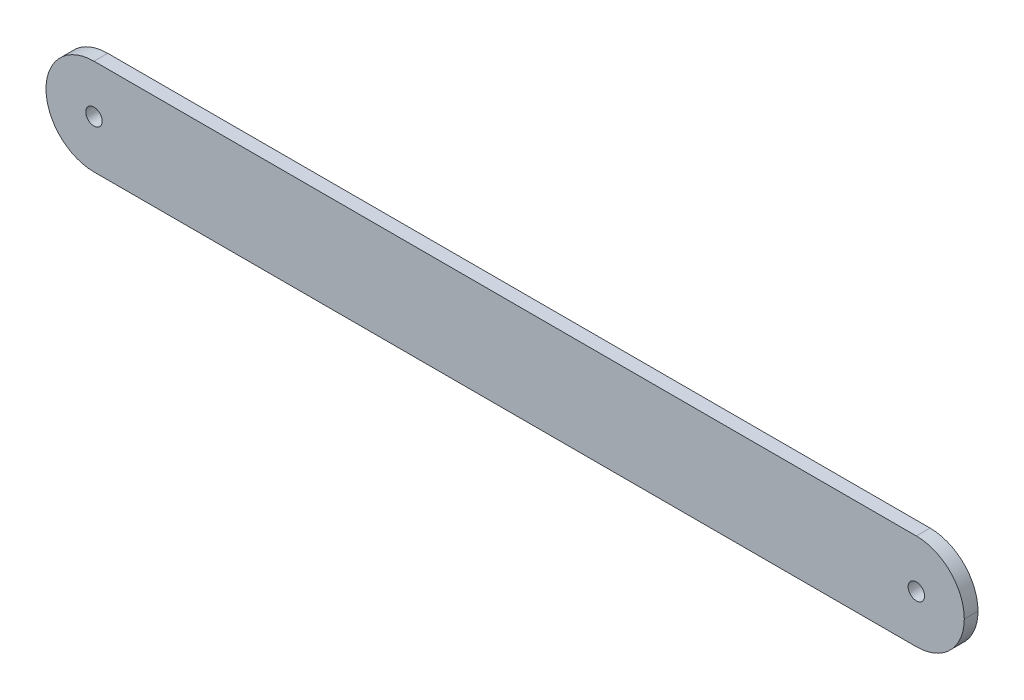
ISO-10303-21;
HEADER;
FILE_DESCRIPTION(('STEP AP214'),'2;1');
FILE_NAME('part.step','',(''),(''),'','','');
FILE_SCHEMA(('AUTOMOTIVE_DESIGN { 1 0 10303 214 1 1 1 1 }'));
ENDSEC;
DATA;
#1=APPLICATION_CONTEXT('core data for automotive mechanical design processes');
#2=APPLICATION_PROTOCOL_DEFINITION('international standard','automotive_design',2000,#1);
#3=PRODUCT_CONTEXT('',#1,'mechanical');
#4=PRODUCT('Part','Part','',(#3));
#5=PRODUCT_RELATED_PRODUCT_CATEGORY('part','',(#4));
#6=PRODUCT_DEFINITION_FORMATION('','',#4);
#7=PRODUCT_DEFINITION_CONTEXT('part definition',#1,'design');
#8=PRODUCT_DEFINITION('design','',#6,#7);
#9=PRODUCT_DEFINITION_SHAPE('','',#8);
#10=(LENGTH_UNIT() NAMED_UNIT(*) SI_UNIT(.MILLI.,.METRE.));
#11=(NAMED_UNIT(*) PLANE_ANGLE_UNIT() SI_UNIT($,.RADIAN.));
#12=(NAMED_UNIT(*) SI_UNIT($,.STERADIAN.) SOLID_ANGLE_UNIT());
#13=UNCERTAINTY_MEASURE_WITH_UNIT(LENGTH_MEASURE(1.E-05),#10,'distance_accuracy_value','');
#14=(GEOMETRIC_REPRESENTATION_CONTEXT(3) GLOBAL_UNCERTAINTY_ASSIGNED_CONTEXT((#13)) GLOBAL_UNIT_ASSIGNED_CONTEXT((#10,
#11,#12)) REPRESENTATION_CONTEXT('',''));
#15=CARTESIAN_POINT('',(0.,0.,0.));
#16=DIRECTION('',(0.,0.,1.));
#17=DIRECTION('',(1.,0.,0.));
#18=AXIS2_PLACEMENT_3D('',#15,#16,#17);
#19=CARTESIAN_POINT('',(-335.,35.,10.));
#20=DIRECTION('',(0.,-1.,0.));
#21=DIRECTION('',(0.,0.,-1.));
#22=AXIS2_PLACEMENT_3D('',#19,#20,#21);
#23=PLANE('',#22);
#24=DIRECTION('',(-1.,0.,0.));
#25=VECTOR('',#24,1.);
#26=CARTESIAN_POINT('',(-335.,35.,10.));
#27=LINE('',#26,#25);
#28=CARTESIAN_POINT('',(300.,35.,10.));
#29=VERTEX_POINT('',#28);
#30=CARTESIAN_POINT('',(-300.,35.,10.));
#31=VERTEX_POINT('',#30);
#32=EDGE_CURVE('E132',#29,#31,#27,.T.);
#33=ORIENTED_EDGE('',*,*,#32,.F.);
#34=DIRECTION('',(0.,0.,-1.));
#35=VECTOR('',#34,1.);
#36=CARTESIAN_POINT('',(300.,35.,10.));
#37=LINE('',#36,#35);
#38=CARTESIAN_POINT('',(300.,35.,0.));
#39=VERTEX_POINT('',#38);
#40=EDGE_CURVE('E11',#29,#39,#37,.T.);
#41=ORIENTED_EDGE('',*,*,#40,.T.);
#42=DIRECTION('',(-1.,0.,0.));
#43=VECTOR('',#42,1.);
#44=CARTESIAN_POINT('',(-335.,35.,0.));
#45=LINE('',#44,#43);
#46=CARTESIAN_POINT('',(-300.,35.,0.));
#47=VERTEX_POINT('',#46);
#48=EDGE_CURVE('E95',#39,#47,#45,.T.);
#49=ORIENTED_EDGE('',*,*,#48,.T.);
#50=DIRECTION('',(0.,0.,-1.));
#51=VECTOR('',#50,1.);
#52=CARTESIAN_POINT('',(-300.,35.,10.));
#53=LINE('',#52,#51);
#54=EDGE_CURVE('E42',#47,#31,#53,.F.);
#55=ORIENTED_EDGE('',*,*,#54,.T.);
#56=EDGE_LOOP('',(#33,#41,#49,#55));
#57=FACE_BOUND('',#56,.T.);
#58=ADVANCED_FACE('F33',(#57),#23,.F.);
#59=CARTESIAN_POINT('',(-335.,-35.,10.));
#60=DIRECTION('',(0.,1.,0.));
#61=DIRECTION('',(0.,0.,1.));
#62=AXIS2_PLACEMENT_3D('',#59,#60,#61);
#63=PLANE('',#62);
#64=DIRECTION('',(1.,0.,0.));
#65=VECTOR('',#64,1.);
#66=CARTESIAN_POINT('',(-335.,-35.,0.));
#67=LINE('',#66,#65);
#68=CARTESIAN_POINT('',(-300.,-35.,0.));
#69=VERTEX_POINT('',#68);
#70=CARTESIAN_POINT('',(300.,-35.,0.));
#71=VERTEX_POINT('',#70);
#72=EDGE_CURVE('E131',#69,#71,#67,.T.);
#73=ORIENTED_EDGE('',*,*,#72,.T.);
#74=DIRECTION('',(0.,0.,-1.));
#75=VECTOR('',#74,1.);
#76=CARTESIAN_POINT('',(300.,-35.,10.));
#77=LINE('',#76,#75);
#78=CARTESIAN_POINT('',(300.,-35.,10.));
#79=VERTEX_POINT('',#78);
#80=EDGE_CURVE('E110',#71,#79,#77,.F.);
#81=ORIENTED_EDGE('',*,*,#80,.T.);
#82=DIRECTION('',(1.,0.,0.));
#83=VECTOR('',#82,1.);
#84=CARTESIAN_POINT('',(-335.,-35.,10.));
#85=LINE('',#84,#83);
#86=CARTESIAN_POINT('',(-300.,-35.,10.));
#87=VERTEX_POINT('',#86);
#88=EDGE_CURVE('E127',#87,#79,#85,.T.);
#89=ORIENTED_EDGE('',*,*,#88,.F.);
#90=DIRECTION('',(0.,0.,-1.));
#91=VECTOR('',#90,1.);
#92=CARTESIAN_POINT('',(-300.,-35.,10.));
#93=LINE('',#92,#91);
#94=EDGE_CURVE('E111',#87,#69,#93,.T.);
#95=ORIENTED_EDGE('',*,*,#94,.T.);
#96=EDGE_LOOP('',(#73,#81,#89,#95));
#97=FACE_BOUND('',#96,.T.);
#98=ADVANCED_FACE('F129',(#97),#63,.F.);
#99=CARTESIAN_POINT('',(0.,0.,10.));
#100=DIRECTION('',(0.,0.,-1.));
#101=DIRECTION('',(-1.,0.,0.));
#102=AXIS2_PLACEMENT_3D('',#99,#100,#101);
#103=PLANE('',#102);
#104=CARTESIAN_POINT('',(-300.,0.,10.));
#105=DIRECTION('',(0.,0.,1.));
#106=DIRECTION('',(1.,0.,0.));
#107=AXIS2_PLACEMENT_3D('',#104,#105,#106);
#108=CIRCLE('',#107,5.99999999999999);
#109=CARTESIAN_POINT('',(-294.,0.,10.));
#110=VERTEX_POINT('',#109);
#111=EDGE_CURVE('E187',#110,#110,#108,.T.);
#112=ORIENTED_EDGE('',*,*,#111,.F.);
#113=EDGE_LOOP('',(#112));
#114=FACE_BOUND('',#113,.T.);
#115=CARTESIAN_POINT('',(300.,0.,10.));
#116=DIRECTION('',(0.,0.,1.));
#117=DIRECTION('',(1.,0.,0.));
#118=AXIS2_PLACEMENT_3D('',#115,#116,#117);
#119=CIRCLE('',#118,5.99999999999999);
#120=CARTESIAN_POINT('',(306.,0.,10.));
#121=VERTEX_POINT('',#120);
#122=EDGE_CURVE('E106',#121,#121,#119,.T.);
#123=ORIENTED_EDGE('',*,*,#122,.F.);
#124=EDGE_LOOP('',(#123));
#125=FACE_BOUND('',#124,.T.);
#126=ORIENTED_EDGE('',*,*,#88,.T.);
#127=CARTESIAN_POINT('',(300.,0.,10.));
#128=DIRECTION('',(0.,0.,-1.));
#129=DIRECTION('',(-1.,0.,0.));
#130=AXIS2_PLACEMENT_3D('',#127,#128,#129);
#131=CIRCLE('',#130,35.);
#132=CARTESIAN_POINT('',(335.,0.,10.));
#133=VERTEX_POINT('',#132);
#134=EDGE_CURVE('E122',#79,#133,#131,.F.);
#135=ORIENTED_EDGE('',*,*,#134,.T.);
#136=CARTESIAN_POINT('',(300.,0.,10.));
#137=DIRECTION('',(0.,0.,-1.));
#138=DIRECTION('',(-1.,0.,0.));
#139=AXIS2_PLACEMENT_3D('',#136,#137,#138);
#140=CIRCLE('',#139,35.);
#141=EDGE_CURVE('E104',#133,#29,#140,.F.);
#142=ORIENTED_EDGE('',*,*,#141,.T.);
#143=ORIENTED_EDGE('',*,*,#32,.T.);
#144=CARTESIAN_POINT('',(-300.,0.,10.));
#145=DIRECTION('',(0.,0.,-1.));
#146=DIRECTION('',(-1.,0.,0.));
#147=AXIS2_PLACEMENT_3D('',#144,#145,#146);
#148=CIRCLE('',#147,35.);
#149=CARTESIAN_POINT('',(-335.,0.,10.));
#150=VERTEX_POINT('',#149);
#151=EDGE_CURVE('E50',#31,#150,#148,.F.);
#152=ORIENTED_EDGE('',*,*,#151,.T.);
#153=CARTESIAN_POINT('',(-300.,0.,10.));
#154=DIRECTION('',(0.,0.,-1.));
#155=DIRECTION('',(-1.,0.,0.));
#156=AXIS2_PLACEMENT_3D('',#153,#154,#155);
#157=CIRCLE('',#156,35.);
#158=EDGE_CURVE('E119',#150,#87,#157,.F.);
#159=ORIENTED_EDGE('',*,*,#158,.T.);
#160=EDGE_LOOP('',(#126,#135,#142,#143,#152,#159));
#161=FACE_BOUND('',#160,.T.);
#162=ADVANCED_FACE('F125',(#114,#125,#161),#103,.F.);
#163=CARTESIAN_POINT('',(0.,0.,0.));
#164=DIRECTION('',(0.,0.,-1.));
#165=DIRECTION('',(-1.,0.,0.));
#166=AXIS2_PLACEMENT_3D('',#163,#164,#165);
#167=PLANE('',#166);
#168=CARTESIAN_POINT('',(-300.,0.,0.));
#169=DIRECTION('',(0.,0.,1.));
#170=DIRECTION('',(1.,0.,0.));
#171=AXIS2_PLACEMENT_3D('',#168,#169,#170);
#172=CIRCLE('',#171,5.99999999999999);
#173=CARTESIAN_POINT('',(-294.,0.,0.));
#174=VERTEX_POINT('',#173);
#175=EDGE_CURVE('E135',#174,#174,#172,.T.);
#176=ORIENTED_EDGE('',*,*,#175,.T.);
#177=EDGE_LOOP('',(#176));
#178=FACE_BOUND('',#177,.T.);
#179=CARTESIAN_POINT('',(300.,0.,0.));
#180=DIRECTION('',(0.,0.,1.));
#181=DIRECTION('',(1.,0.,0.));
#182=AXIS2_PLACEMENT_3D('',#179,#180,#181);
#183=CIRCLE('',#182,5.99999999999999);
#184=CARTESIAN_POINT('',(306.,0.,0.));
#185=VERTEX_POINT('',#184);
#186=EDGE_CURVE('E186',#185,#185,#183,.T.);
#187=ORIENTED_EDGE('',*,*,#186,.T.);
#188=EDGE_LOOP('',(#187));
#189=FACE_BOUND('',#188,.T.);
#190=CARTESIAN_POINT('',(300.,0.,0.));
#191=DIRECTION('',(0.,0.,-1.));
#192=DIRECTION('',(-1.,0.,0.));
#193=AXIS2_PLACEMENT_3D('',#190,#191,#192);
#194=CIRCLE('',#193,35.);
#195=CARTESIAN_POINT('',(335.,0.,0.));
#196=VERTEX_POINT('',#195);
#197=EDGE_CURVE('E88',#39,#196,#194,.T.);
#198=ORIENTED_EDGE('',*,*,#197,.T.);
#199=CARTESIAN_POINT('',(300.,0.,0.));
#200=DIRECTION('',(0.,0.,-1.));
#201=DIRECTION('',(-1.,0.,0.));
#202=AXIS2_PLACEMENT_3D('',#199,#200,#201);
#203=CIRCLE('',#202,35.);
#204=EDGE_CURVE('E93',#196,#71,#203,.T.);
#205=ORIENTED_EDGE('',*,*,#204,.T.);
#206=ORIENTED_EDGE('',*,*,#72,.F.);
#207=CARTESIAN_POINT('',(-300.,0.,0.));
#208=DIRECTION('',(0.,0.,-1.));
#209=DIRECTION('',(-1.,0.,0.));
#210=AXIS2_PLACEMENT_3D('',#207,#208,#209);
#211=CIRCLE('',#210,35.);
#212=CARTESIAN_POINT('',(-335.,0.,0.));
#213=VERTEX_POINT('',#212);
#214=EDGE_CURVE('E98',#69,#213,#211,.T.);
#215=ORIENTED_EDGE('',*,*,#214,.T.);
#216=CARTESIAN_POINT('',(-300.,0.,0.));
#217=DIRECTION('',(0.,0.,-1.));
#218=DIRECTION('',(-1.,0.,0.));
#219=AXIS2_PLACEMENT_3D('',#216,#217,#218);
#220=CIRCLE('',#219,35.);
#221=EDGE_CURVE('E139',#213,#47,#220,.T.);
#222=ORIENTED_EDGE('',*,*,#221,.T.);
#223=ORIENTED_EDGE('',*,*,#48,.F.);
#224=EDGE_LOOP('',(#198,#205,#206,#215,#222,#223));
#225=FACE_BOUND('',#224,.T.);
#226=ADVANCED_FACE('F90',(#178,#189,#225),#167,.T.);
#227=CARTESIAN_POINT('',(300.,0.,0.));
#228=DIRECTION('',(0.,0.,1.));
#229=DIRECTION('',(1.,0.,0.));
#230=AXIS2_PLACEMENT_3D('',#227,#228,#229);
#231=CYLINDRICAL_SURFACE('',#230,5.99999999999999);
#232=ORIENTED_EDGE('',*,*,#186,.F.);
#233=EDGE_LOOP('',(#232));
#234=FACE_BOUND('',#233,.T.);
#235=ORIENTED_EDGE('',*,*,#122,.T.);
#236=EDGE_LOOP('',(#235));
#237=FACE_BOUND('',#236,.T.);
#238=ADVANCED_FACE('F165',(#234,#237),#231,.F.);
#239=CARTESIAN_POINT('',(-300.,0.,0.));
#240=DIRECTION('',(0.,0.,1.));
#241=DIRECTION('',(1.,0.,0.));
#242=AXIS2_PLACEMENT_3D('',#239,#240,#241);
#243=CYLINDRICAL_SURFACE('',#242,5.99999999999999);
#244=ORIENTED_EDGE('',*,*,#175,.F.);
#245=EDGE_LOOP('',(#244));
#246=FACE_BOUND('',#245,.T.);
#247=ORIENTED_EDGE('',*,*,#111,.T.);
#248=EDGE_LOOP('',(#247));
#249=FACE_BOUND('',#248,.T.);
#250=ADVANCED_FACE('F161',(#246,#249),#243,.F.);
#251=CARTESIAN_POINT('',(300.,0.,10.));
#252=DIRECTION('',(0.,0.,-1.));
#253=DIRECTION('',(-1.,0.,0.));
#254=AXIS2_PLACEMENT_3D('',#251,#252,#253);
#255=CYLINDRICAL_SURFACE('',#254,35.);
#256=ORIENTED_EDGE('',*,*,#40,.F.);
#257=ORIENTED_EDGE('',*,*,#141,.F.);
#258=DIRECTION('',(0.,0.,-1.));
#259=VECTOR('',#258,1.);
#260=CARTESIAN_POINT('',(335.,0.,10.));
#261=LINE('',#260,#259);
#262=EDGE_CURVE('E102',#196,#133,#261,.F.);
#263=ORIENTED_EDGE('',*,*,#262,.F.);
#264=ORIENTED_EDGE('',*,*,#197,.F.);
#265=EDGE_LOOP('',(#256,#257,#263,#264));
#266=FACE_BOUND('',#265,.T.);
#267=ADVANCED_FACE('F103',(#266),#255,.T.);
#268=CARTESIAN_POINT('',(300.,0.,10.));
#269=DIRECTION('',(0.,0.,-1.));
#270=DIRECTION('',(-1.,0.,0.));
#271=AXIS2_PLACEMENT_3D('',#268,#269,#270);
#272=CYLINDRICAL_SURFACE('',#271,35.);
#273=ORIENTED_EDGE('',*,*,#134,.F.);
#274=ORIENTED_EDGE('',*,*,#80,.F.);
#275=ORIENTED_EDGE('',*,*,#204,.F.);
#276=ORIENTED_EDGE('',*,*,#262,.T.);
#277=EDGE_LOOP('',(#273,#274,#275,#276));
#278=FACE_BOUND('',#277,.T.);
#279=ADVANCED_FACE('F108',(#278),#272,.T.);
#280=CARTESIAN_POINT('',(-300.,0.,10.));
#281=DIRECTION('',(0.,0.,-1.));
#282=DIRECTION('',(-1.,0.,0.));
#283=AXIS2_PLACEMENT_3D('',#280,#281,#282);
#284=CYLINDRICAL_SURFACE('',#283,35.);
#285=DIRECTION('',(0.,0.,-1.));
#286=VECTOR('',#285,1.);
#287=CARTESIAN_POINT('',(-335.,0.,10.));
#288=LINE('',#287,#286);
#289=EDGE_CURVE('E37',#150,#213,#288,.T.);
#290=ORIENTED_EDGE('',*,*,#289,.F.);
#291=ORIENTED_EDGE('',*,*,#151,.F.);
#292=ORIENTED_EDGE('',*,*,#54,.F.);
#293=ORIENTED_EDGE('',*,*,#221,.F.);
#294=EDGE_LOOP('',(#290,#291,#292,#293));
#295=FACE_BOUND('',#294,.T.);
#296=ADVANCED_FACE('F35',(#295),#284,.T.);
#297=CARTESIAN_POINT('',(-300.,0.,10.));
#298=DIRECTION('',(0.,0.,-1.));
#299=DIRECTION('',(-1.,0.,0.));
#300=AXIS2_PLACEMENT_3D('',#297,#298,#299);
#301=CYLINDRICAL_SURFACE('',#300,35.);
#302=ORIENTED_EDGE('',*,*,#158,.F.);
#303=ORIENTED_EDGE('',*,*,#289,.T.);
#304=ORIENTED_EDGE('',*,*,#214,.F.);
#305=ORIENTED_EDGE('',*,*,#94,.F.);
#306=EDGE_LOOP('',(#302,#303,#304,#305));
#307=FACE_BOUND('',#306,.T.);
#308=ADVANCED_FACE('F145',(#307),#301,.T.);
#309=CLOSED_SHELL('',(#58,#98,#162,#226,#238,#250,#267,#279,#296,#308));
#310=MANIFOLD_SOLID_BREP('B2',#309);
#311=ADVANCED_BREP_SHAPE_REPRESENTATION('',(#18,#310),#14);
#312=SHAPE_DEFINITION_REPRESENTATION(#9,#311);
ENDSEC;
END-ISO-10303-21;
